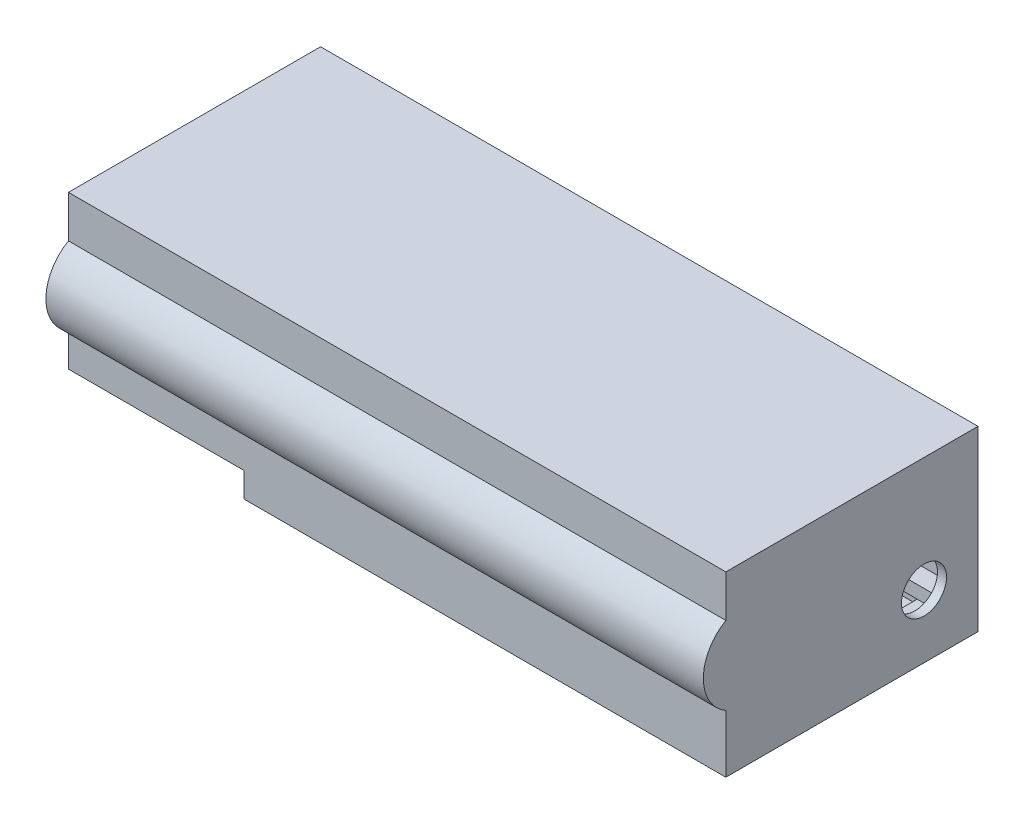
ISO-10303-21;
HEADER;
FILE_DESCRIPTION(('STEP AP214'),'2;1');
FILE_NAME('part.step','',(''),(''),'','','');
FILE_SCHEMA(('AUTOMOTIVE_DESIGN { 1 0 10303 214 1 1 1 1 }'));
ENDSEC;
DATA;
#1=APPLICATION_CONTEXT('core data for automotive mechanical design processes');
#2=APPLICATION_PROTOCOL_DEFINITION('international standard','automotive_design',2000,#1);
#3=PRODUCT_CONTEXT('',#1,'mechanical');
#4=PRODUCT('Part','Part','',(#3));
#5=PRODUCT_RELATED_PRODUCT_CATEGORY('part','',(#4));
#6=PRODUCT_DEFINITION_FORMATION('','',#4);
#7=PRODUCT_DEFINITION_CONTEXT('part definition',#1,'design');
#8=PRODUCT_DEFINITION('design','',#6,#7);
#9=PRODUCT_DEFINITION_SHAPE('','',#8);
#10=(LENGTH_UNIT() NAMED_UNIT(*) SI_UNIT(.MILLI.,.METRE.));
#11=(NAMED_UNIT(*) PLANE_ANGLE_UNIT() SI_UNIT($,.RADIAN.));
#12=(NAMED_UNIT(*) SI_UNIT($,.STERADIAN.) SOLID_ANGLE_UNIT());
#13=UNCERTAINTY_MEASURE_WITH_UNIT(LENGTH_MEASURE(1.E-05),#10,'distance_accuracy_value','');
#14=(GEOMETRIC_REPRESENTATION_CONTEXT(3) GLOBAL_UNCERTAINTY_ASSIGNED_CONTEXT((#13)) GLOBAL_UNIT_ASSIGNED_CONTEXT((#10,
#11,#12)) REPRESENTATION_CONTEXT('',''));
#15=CARTESIAN_POINT('',(0.,0.,0.));
#16=DIRECTION('',(0.,0.,1.));
#17=DIRECTION('',(1.,0.,0.));
#18=AXIS2_PLACEMENT_3D('',#15,#16,#17);
#19=CARTESIAN_POINT('',(144.,39.5,28.));
#20=DIRECTION('',(0.,0.,1.));
#21=DIRECTION('',(0.,-1.,0.));
#22=AXIS2_PLACEMENT_3D('',#19,#20,#21);
#23=PLANE('',#22);
#24=DIRECTION('',(1.,0.,0.));
#25=VECTOR('',#24,1.);
#26=CARTESIAN_POINT('',(0.,30.1602540378444,28.));
#27=LINE('',#26,#25);
#28=CARTESIAN_POINT('',(0.,30.1602540378444,28.));
#29=VERTEX_POINT('',#28);
#30=CARTESIAN_POINT('',(146.,30.1602540378444,28.));
#31=VERTEX_POINT('',#30);
#32=EDGE_CURVE('E293',#29,#31,#27,.T.);
#33=ORIENTED_EDGE('',*,*,#32,.T.);
#34=DIRECTION('',(0.,-1.,0.));
#35=VECTOR('',#34,1.);
#36=CARTESIAN_POINT('',(146.,39.5,28.));
#37=LINE('',#36,#35);
#38=CARTESIAN_POINT('',(146.,39.5,28.));
#39=VERTEX_POINT('',#38);
#40=EDGE_CURVE('E449',#39,#31,#37,.T.);
#41=ORIENTED_EDGE('',*,*,#40,.F.);
#42=DIRECTION('',(-1.,0.,0.));
#43=VECTOR('',#42,1.);
#44=CARTESIAN_POINT('',(144.,39.5,28.));
#45=LINE('',#44,#43);
#46=CARTESIAN_POINT('',(0.,39.5,28.));
#47=VERTEX_POINT('',#46);
#48=EDGE_CURVE('E371',#39,#47,#45,.T.);
#49=ORIENTED_EDGE('',*,*,#48,.T.);
#50=DIRECTION('',(0.,1.,0.));
#51=VECTOR('',#50,1.);
#52=CARTESIAN_POINT('',(0.,39.5,28.));
#53=LINE('',#52,#51);
#54=EDGE_CURVE('E338',#29,#47,#53,.T.);
#55=ORIENTED_EDGE('',*,*,#54,.F.);
#56=EDGE_LOOP('',(#33,#41,#49,#55));
#57=FACE_BOUND('',#56,.T.);
#58=ADVANCED_FACE('F35',(#57),#23,.T.);
#59=CARTESIAN_POINT('',(146.,12.8397459621556,28.));
#60=VERTEX_POINT('',#59);
#61=CARTESIAN_POINT('',(146.,0.,28.));
#62=VERTEX_POINT('',#61);
#63=EDGE_CURVE('E500',#60,#62,#37,.T.);
#64=ORIENTED_EDGE('',*,*,#63,.F.);
#65=DIRECTION('',(1.,0.,0.));
#66=VECTOR('',#65,1.);
#67=CARTESIAN_POINT('',(0.,12.8397459621556,28.));
#68=LINE('',#67,#66);
#69=CARTESIAN_POINT('',(0.,12.8397459621556,28.));
#70=VERTEX_POINT('',#69);
#71=EDGE_CURVE('E292',#70,#60,#68,.T.);
#72=ORIENTED_EDGE('',*,*,#71,.F.);
#73=CARTESIAN_POINT('',(0.,5.5,28.));
#74=VERTEX_POINT('',#73);
#75=EDGE_CURVE('E350',#74,#70,#53,.T.);
#76=ORIENTED_EDGE('',*,*,#75,.F.);
#77=DIRECTION('',(-1.,0.,0.));
#78=VECTOR('',#77,1.);
#79=CARTESIAN_POINT('',(144.,5.5,28.));
#80=LINE('',#79,#78);
#81=CARTESIAN_POINT('',(39.,5.5,28.));
#82=VERTEX_POINT('',#81);
#83=EDGE_CURVE('E276',#82,#74,#80,.T.);
#84=ORIENTED_EDGE('',*,*,#83,.F.);
#85=DIRECTION('',(0.,1.,0.));
#86=VECTOR('',#85,1.);
#87=CARTESIAN_POINT('',(39.,39.5,28.));
#88=LINE('',#87,#86);
#89=CARTESIAN_POINT('',(39.,0.,28.));
#90=VERTEX_POINT('',#89);
#91=EDGE_CURVE('E246',#90,#82,#88,.T.);
#92=ORIENTED_EDGE('',*,*,#91,.F.);
#93=DIRECTION('',(-1.,0.,0.));
#94=VECTOR('',#93,1.);
#95=CARTESIAN_POINT('',(144.,0.,28.));
#96=LINE('',#95,#94);
#97=EDGE_CURVE('E369',#62,#90,#96,.T.);
#98=ORIENTED_EDGE('',*,*,#97,.F.);
#99=EDGE_LOOP('',(#64,#72,#76,#84,#92,#98));
#100=FACE_BOUND('',#99,.T.);
#101=ADVANCED_FACE('F516',(#100),#23,.T.);
#102=CARTESIAN_POINT('',(0.,37.5,26.));
#103=DIRECTION('',(0.,0.,-1.));
#104=DIRECTION('',(0.,1.,0.));
#105=AXIS2_PLACEMENT_3D('',#102,#103,#104);
#106=PLANE('',#105);
#107=DIRECTION('',(1.,0.,0.));
#108=VECTOR('',#107,1.);
#109=CARTESIAN_POINT('',(0.,28.0366310572456,26.));
#110=LINE('',#109,#108);
#111=CARTESIAN_POINT('',(0.,28.0366310572456,26.));
#112=VERTEX_POINT('',#111);
#113=CARTESIAN_POINT('',(144.,28.0366310572456,26.));
#114=VERTEX_POINT('',#113);
#115=EDGE_CURVE('E285',#112,#114,#110,.T.);
#116=ORIENTED_EDGE('',*,*,#115,.F.);
#117=DIRECTION('',(0.,1.,0.));
#118=VECTOR('',#117,1.);
#119=CARTESIAN_POINT('',(0.,37.5,26.));
#120=LINE('',#119,#118);
#121=CARTESIAN_POINT('',(0.,37.5,26.));
#122=VERTEX_POINT('',#121);
#123=EDGE_CURVE('E296',#112,#122,#120,.T.);
#124=ORIENTED_EDGE('',*,*,#123,.T.);
#125=DIRECTION('',(1.,0.,0.));
#126=VECTOR('',#125,1.);
#127=CARTESIAN_POINT('',(0.,37.5,26.));
#128=LINE('',#127,#126);
#129=CARTESIAN_POINT('',(144.,37.5,26.));
#130=VERTEX_POINT('',#129);
#131=EDGE_CURVE('E303',#122,#130,#128,.T.);
#132=ORIENTED_EDGE('',*,*,#131,.T.);
#133=DIRECTION('',(0.,-1.,0.));
#134=VECTOR('',#133,1.);
#135=CARTESIAN_POINT('',(144.,0.,26.));
#136=LINE('',#135,#134);
#137=EDGE_CURVE('E316',#130,#114,#136,.T.);
#138=ORIENTED_EDGE('',*,*,#137,.T.);
#139=EDGE_LOOP('',(#116,#124,#132,#138));
#140=FACE_BOUND('',#139,.T.);
#141=ADVANCED_FACE('F543',(#140),#106,.T.);
#142=CARTESIAN_POINT('',(0.,0.,0.));
#143=DIRECTION('',(-1.,0.,0.));
#144=DIRECTION('',(0.,0.,1.));
#145=AXIS2_PLACEMENT_3D('',#142,#143,#144);
#146=PLANE('',#145);
#147=DIRECTION('',(0.,0.,1.));
#148=VECTOR('',#147,1.);
#149=CARTESIAN_POINT('',(0.,5.5,25.));
#150=LINE('',#149,#148);
#151=CARTESIAN_POINT('',(0.,5.5,22.));
#152=VERTEX_POINT('',#151);
#153=EDGE_CURVE('E352',#152,#74,#150,.T.);
#154=ORIENTED_EDGE('',*,*,#153,.T.);
#155=ORIENTED_EDGE('',*,*,#75,.T.);
#156=CARTESIAN_POINT('',(0.,21.5,23.));
#157=DIRECTION('',(1.,0.,0.));
#158=DIRECTION('',(0.,0.,-1.));
#159=AXIS2_PLACEMENT_3D('',#156,#157,#158);
#160=CIRCLE('',#159,10.);
#161=EDGE_CURVE('E289',#29,#70,#160,.T.);
#162=ORIENTED_EDGE('',*,*,#161,.F.);
#163=ORIENTED_EDGE('',*,*,#54,.T.);
#164=DIRECTION('',(0.,0.,1.));
#165=VECTOR('',#164,1.);
#166=CARTESIAN_POINT('',(0.,39.5,0.));
#167=LINE('',#166,#165);
#168=CARTESIAN_POINT('',(0.,39.5,-28.));
#169=VERTEX_POINT('',#168);
#170=EDGE_CURVE('E378',#169,#47,#167,.T.);
#171=ORIENTED_EDGE('',*,*,#170,.F.);
#172=DIRECTION('',(0.,1.,0.));
#173=VECTOR('',#172,1.);
#174=CARTESIAN_POINT('',(0.,39.5,-28.));
#175=LINE('',#174,#173);
#176=CARTESIAN_POINT('',(0.,5.50000000000002,-28.));
#177=VERTEX_POINT('',#176);
#178=EDGE_CURVE('E391',#177,#169,#175,.T.);
#179=ORIENTED_EDGE('',*,*,#178,.F.);
#180=DIRECTION('',(0.,0.,-1.));
#181=VECTOR('',#180,1.);
#182=CARTESIAN_POINT('',(0.,5.5,-25.));
#183=LINE('',#182,#181);
#184=CARTESIAN_POINT('',(0.,5.5,-22.));
#185=VERTEX_POINT('',#184);
#186=EDGE_CURVE('E389',#185,#177,#183,.T.);
#187=ORIENTED_EDGE('',*,*,#186,.F.);
#188=DIRECTION('',(0.,-1.,0.));
#189=VECTOR('',#188,1.);
#190=CARTESIAN_POINT('',(0.,5.5,-22.));
#191=LINE('',#190,#189);
#192=CARTESIAN_POINT('',(0.,8.32842712474619,-22.));
#193=VERTEX_POINT('',#192);
#194=EDGE_CURVE('E386',#193,#185,#191,.T.);
#195=ORIENTED_EDGE('',*,*,#194,.F.);
#196=DIRECTION('',(0.,0.,-1.));
#197=VECTOR('',#196,1.);
#198=CARTESIAN_POINT('',(0.,8.32842712474619,-22.));
#199=LINE('',#198,#197);
#200=CARTESIAN_POINT('',(0.,8.32842712474619,-26.));
#201=VERTEX_POINT('',#200);
#202=EDGE_CURVE('E319',#193,#201,#199,.T.);
#203=ORIENTED_EDGE('',*,*,#202,.T.);
#204=DIRECTION('',(0.,1.,0.));
#205=VECTOR('',#204,1.);
#206=CARTESIAN_POINT('',(0.,37.5,-26.));
#207=LINE('',#206,#205);
#208=CARTESIAN_POINT('',(0.,37.5,-26.));
#209=VERTEX_POINT('',#208);
#210=EDGE_CURVE('E322',#201,#209,#207,.T.);
#211=ORIENTED_EDGE('',*,*,#210,.T.);
#212=DIRECTION('',(0.,0.,-1.));
#213=VECTOR('',#212,1.);
#214=CARTESIAN_POINT('',(0.,37.5,-22.));
#215=LINE('',#214,#213);
#216=EDGE_CURVE('E374',#122,#209,#215,.T.);
#217=ORIENTED_EDGE('',*,*,#216,.F.);
#218=ORIENTED_EDGE('',*,*,#123,.F.);
#219=CARTESIAN_POINT('',(0.,21.3284271247462,24.));
#220=DIRECTION('',(1.,0.,0.));
#221=DIRECTION('',(0.,0.,-1.));
#222=AXIS2_PLACEMENT_3D('',#219,#220,#221);
#223=CIRCLE('',#222,7.);
#224=CARTESIAN_POINT('',(0.,14.6202231922468,26.));
#225=VERTEX_POINT('',#224);
#226=EDGE_CURVE('E279',#112,#225,#223,.T.);
#227=ORIENTED_EDGE('',*,*,#226,.T.);
#228=CARTESIAN_POINT('',(0.,8.32842712474619,26.));
#229=VERTEX_POINT('',#228);
#230=EDGE_CURVE('E298',#229,#225,#120,.T.);
#231=ORIENTED_EDGE('',*,*,#230,.F.);
#232=DIRECTION('',(0.,0.,1.));
#233=VECTOR('',#232,1.);
#234=CARTESIAN_POINT('',(0.,8.32842712474619,22.));
#235=LINE('',#234,#233);
#236=CARTESIAN_POINT('',(0.,8.32842712474619,22.));
#237=VERTEX_POINT('',#236);
#238=EDGE_CURVE('E301',#237,#229,#235,.T.);
#239=ORIENTED_EDGE('',*,*,#238,.F.);
#240=DIRECTION('',(0.,-1.,0.));
#241=VECTOR('',#240,1.);
#242=CARTESIAN_POINT('',(0.,5.5,22.));
#243=LINE('',#242,#241);
#244=EDGE_CURVE('E343',#237,#152,#243,.T.);
#245=ORIENTED_EDGE('',*,*,#244,.T.);
#246=EDGE_LOOP('',(#154,#155,#162,#163,#171,#179,#187,#195,#203,#211,#217,#218,#227,#231,#239,#245));
#247=FACE_BOUND('',#246,.T.);
#248=ADVANCED_FACE('F528',(#247),#146,.T.);
#249=CARTESIAN_POINT('',(144.,5.5,22.));
#250=DIRECTION('',(0.,0.,-1.));
#251=DIRECTION('',(-1.,0.,0.));
#252=AXIS2_PLACEMENT_3D('',#249,#250,#251);
#253=PLANE('',#252);
#254=ORIENTED_EDGE('',*,*,#244,.F.);
#255=DIRECTION('',(1.,0.,0.));
#256=VECTOR('',#255,1.);
#257=CARTESIAN_POINT('',(0.,8.32842712474619,22.));
#258=LINE('',#257,#256);
#259=CARTESIAN_POINT('',(144.,8.32842712474619,22.));
#260=VERTEX_POINT('',#259);
#261=EDGE_CURVE('E304',#237,#260,#258,.T.);
#262=ORIENTED_EDGE('',*,*,#261,.T.);
#263=DIRECTION('',(0.,-1.,0.));
#264=VECTOR('',#263,1.);
#265=CARTESIAN_POINT('',(144.,5.5,22.));
#266=LINE('',#265,#264);
#267=CARTESIAN_POINT('',(144.,5.5,22.));
#268=VERTEX_POINT('',#267);
#269=EDGE_CURVE('E346',#260,#268,#266,.T.);
#270=ORIENTED_EDGE('',*,*,#269,.T.);
#271=DIRECTION('',(-1.,0.,0.));
#272=VECTOR('',#271,1.);
#273=CARTESIAN_POINT('',(144.,5.5,22.));
#274=LINE('',#273,#272);
#275=EDGE_CURVE('E349',#268,#152,#274,.T.);
#276=ORIENTED_EDGE('',*,*,#275,.T.);
#277=EDGE_LOOP('',(#254,#262,#270,#276));
#278=FACE_BOUND('',#277,.T.);
#279=ADVANCED_FACE('F525',(#278),#253,.T.);
#280=CARTESIAN_POINT('',(144.,37.5,-22.));
#281=DIRECTION('',(0.,1.,0.));
#282=DIRECTION('',(0.,0.,1.));
#283=AXIS2_PLACEMENT_3D('',#280,#281,#282);
#284=PLANE('',#283);
#285=ORIENTED_EDGE('',*,*,#216,.T.);
#286=DIRECTION('',(1.,0.,0.));
#287=VECTOR('',#286,1.);
#288=CARTESIAN_POINT('',(0.,37.5,-26.));
#289=LINE('',#288,#287);
#290=CARTESIAN_POINT('',(144.,37.5,-26.));
#291=VERTEX_POINT('',#290);
#292=EDGE_CURVE('E326',#209,#291,#289,.T.);
#293=ORIENTED_EDGE('',*,*,#292,.T.);
#294=DIRECTION('',(0.,0.,-1.));
#295=VECTOR('',#294,1.);
#296=CARTESIAN_POINT('',(144.,37.5,-22.));
#297=LINE('',#296,#295);
#298=EDGE_CURVE('E375',#130,#291,#297,.T.);
#299=ORIENTED_EDGE('',*,*,#298,.F.);
#300=ORIENTED_EDGE('',*,*,#131,.F.);
#301=EDGE_LOOP('',(#285,#293,#299,#300));
#302=FACE_BOUND('',#301,.T.);
#303=ADVANCED_FACE('F37',(#302),#284,.F.);
#304=CARTESIAN_POINT('',(144.,5.5,-22.));
#305=DIRECTION('',(0.,0.,-1.));
#306=DIRECTION('',(-1.,0.,0.));
#307=AXIS2_PLACEMENT_3D('',#304,#305,#306);
#308=PLANE('',#307);
#309=DIRECTION('',(0.,-1.,0.));
#310=VECTOR('',#309,1.);
#311=CARTESIAN_POINT('',(144.,5.5,-22.));
#312=LINE('',#311,#310);
#313=CARTESIAN_POINT('',(144.,8.32842712474619,-22.));
#314=VERTEX_POINT('',#313);
#315=CARTESIAN_POINT('',(144.,5.5,-22.));
#316=VERTEX_POINT('',#315);
#317=EDGE_CURVE('E377',#314,#316,#312,.T.);
#318=ORIENTED_EDGE('',*,*,#317,.F.);
#319=DIRECTION('',(1.,0.,0.));
#320=VECTOR('',#319,1.);
#321=CARTESIAN_POINT('',(0.,8.32842712474619,-22.));
#322=LINE('',#321,#320);
#323=EDGE_CURVE('E325',#193,#314,#322,.T.);
#324=ORIENTED_EDGE('',*,*,#323,.F.);
#325=ORIENTED_EDGE('',*,*,#194,.T.);
#326=DIRECTION('',(-1.,0.,0.));
#327=VECTOR('',#326,1.);
#328=CARTESIAN_POINT('',(144.,5.5,-22.));
#329=LINE('',#328,#327);
#330=EDGE_CURVE('E408',#316,#185,#329,.T.);
#331=ORIENTED_EDGE('',*,*,#330,.F.);
#332=EDGE_LOOP('',(#318,#324,#325,#331));
#333=FACE_BOUND('',#332,.T.);
#334=ADVANCED_FACE('F562',(#333),#308,.F.);
#335=CARTESIAN_POINT('',(144.,5.5,-25.));
#336=DIRECTION('',(0.,1.,0.));
#337=DIRECTION('',(0.,0.,1.));
#338=AXIS2_PLACEMENT_3D('',#335,#336,#337);
#339=PLANE('',#338);
#340=ORIENTED_EDGE('',*,*,#330,.T.);
#341=ORIENTED_EDGE('',*,*,#186,.T.);
#342=DIRECTION('',(-1.,0.,0.));
#343=VECTOR('',#342,1.);
#344=CARTESIAN_POINT('',(144.,5.50000000000001,-28.));
#345=LINE('',#344,#343);
#346=CARTESIAN_POINT('',(39.,5.50000000000001,-28.));
#347=VERTEX_POINT('',#346);
#348=EDGE_CURVE('E273',#347,#177,#345,.T.);
#349=ORIENTED_EDGE('',*,*,#348,.F.);
#350=DIRECTION('',(0.,0.,-1.));
#351=VECTOR('',#350,1.);
#352=CARTESIAN_POINT('',(39.,5.49999999999999,33.));
#353=LINE('',#352,#351);
#354=CARTESIAN_POINT('',(39.,5.5,-25.));
#355=VERTEX_POINT('',#354);
#356=EDGE_CURVE('E264',#355,#347,#353,.T.);
#357=ORIENTED_EDGE('',*,*,#356,.F.);
#358=DIRECTION('',(-1.,0.,0.));
#359=VECTOR('',#358,1.);
#360=CARTESIAN_POINT('',(144.,5.5,-25.));
#361=LINE('',#360,#359);
#362=CARTESIAN_POINT('',(144.,5.5,-25.));
#363=VERTEX_POINT('',#362);
#364=EDGE_CURVE('E241',#363,#355,#361,.T.);
#365=ORIENTED_EDGE('',*,*,#364,.F.);
#366=DIRECTION('',(0.,0.,-1.));
#367=VECTOR('',#366,1.);
#368=CARTESIAN_POINT('',(144.,5.5,-25.));
#369=LINE('',#368,#367);
#370=EDGE_CURVE('E380',#316,#363,#369,.T.);
#371=ORIENTED_EDGE('',*,*,#370,.F.);
#372=EDGE_LOOP('',(#340,#341,#349,#357,#365,#371));
#373=FACE_BOUND('',#372,.T.);
#374=ADVANCED_FACE('F565',(#373),#339,.F.);
#375=CARTESIAN_POINT('',(144.,1.5,-25.));
#376=DIRECTION('',(0.,0.,-1.));
#377=DIRECTION('',(-1.,0.,0.));
#378=AXIS2_PLACEMENT_3D('',#375,#376,#377);
#379=PLANE('',#378);
#380=DIRECTION('',(0.,-1.,0.));
#381=VECTOR('',#380,1.);
#382=CARTESIAN_POINT('',(121.,3.,-25.));
#383=LINE('',#382,#381);
#384=CARTESIAN_POINT('',(121.,1.5,-25.));
#385=VERTEX_POINT('',#384);
#386=CARTESIAN_POINT('',(121.,0.,-25.));
#387=VERTEX_POINT('',#386);
#388=EDGE_CURVE('E486',#385,#387,#383,.T.);
#389=ORIENTED_EDGE('',*,*,#388,.F.);
#390=DIRECTION('',(-1.,0.,0.));
#391=VECTOR('',#390,1.);
#392=CARTESIAN_POINT('',(144.,1.5,-25.));
#393=LINE('',#392,#391);
#394=CARTESIAN_POINT('',(136.,1.5,-25.));
#395=VERTEX_POINT('',#394);
#396=EDGE_CURVE('E404',#395,#385,#393,.T.);
#397=ORIENTED_EDGE('',*,*,#396,.F.);
#398=DIRECTION('',(0.,1.,0.));
#399=VECTOR('',#398,1.);
#400=CARTESIAN_POINT('',(136.,1.5,-25.));
#401=LINE('',#400,#399);
#402=CARTESIAN_POINT('',(136.,2.99772007729695,-25.));
#403=VERTEX_POINT('',#402);
#404=EDGE_CURVE('E457',#395,#403,#401,.T.);
#405=ORIENTED_EDGE('',*,*,#404,.T.);
#406=DIRECTION('',(1.,0.,0.));
#407=VECTOR('',#406,1.);
#408=CARTESIAN_POINT('',(144.,2.99772007729695,-25.));
#409=LINE('',#408,#407);
#410=CARTESIAN_POINT('',(144.,2.99772007729695,-25.));
#411=VERTEX_POINT('',#410);
#412=EDGE_CURVE('E267',#403,#411,#409,.T.);
#413=ORIENTED_EDGE('',*,*,#412,.T.);
#414=DIRECTION('',(0.,-1.,0.));
#415=VECTOR('',#414,1.);
#416=CARTESIAN_POINT('',(144.,1.5,-25.));
#417=LINE('',#416,#415);
#418=EDGE_CURVE('E382',#363,#411,#417,.T.);
#419=ORIENTED_EDGE('',*,*,#418,.F.);
#420=ORIENTED_EDGE('',*,*,#364,.T.);
#421=DIRECTION('',(0.,-1.,0.));
#422=VECTOR('',#421,1.);
#423=CARTESIAN_POINT('',(39.,1.5,-25.));
#424=LINE('',#423,#422);
#425=CARTESIAN_POINT('',(39.,0.,-25.));
#426=VERTEX_POINT('',#425);
#427=EDGE_CURVE('E233',#355,#426,#424,.T.);
#428=ORIENTED_EDGE('',*,*,#427,.T.);
#429=DIRECTION('',(1.,0.,0.));
#430=VECTOR('',#429,1.);
#431=CARTESIAN_POINT('',(39.,0.,-25.));
#432=LINE('',#431,#430);
#433=EDGE_CURVE('E237',#426,#387,#432,.T.);
#434=ORIENTED_EDGE('',*,*,#433,.T.);
#435=EDGE_LOOP('',(#389,#397,#405,#413,#419,#420,#428,#434));
#436=FACE_BOUND('',#435,.T.);
#437=ADVANCED_FACE('F236',(#436),#379,.F.);
#438=CARTESIAN_POINT('',(144.,1.5,-22.));
#439=DIRECTION('',(0.,-1.,0.));
#440=DIRECTION('',(0.,0.,-1.));
#441=AXIS2_PLACEMENT_3D('',#438,#439,#440);
#442=PLANE('',#441);
#443=ORIENTED_EDGE('',*,*,#396,.T.);
#444=DIRECTION('',(0.,0.,1.));
#445=VECTOR('',#444,1.);
#446=CARTESIAN_POINT('',(121.,1.5,-22.));
#447=LINE('',#446,#445);
#448=CARTESIAN_POINT('',(121.,1.5,-22.));
#449=VERTEX_POINT('',#448);
#450=EDGE_CURVE('E463',#385,#449,#447,.T.);
#451=ORIENTED_EDGE('',*,*,#450,.T.);
#452=DIRECTION('',(-1.,0.,0.));
#453=VECTOR('',#452,1.);
#454=CARTESIAN_POINT('',(144.,1.5,-22.));
#455=LINE('',#454,#453);
#456=CARTESIAN_POINT('',(136.,1.5,-22.));
#457=VERTEX_POINT('',#456);
#458=EDGE_CURVE('E401',#457,#449,#455,.T.);
#459=ORIENTED_EDGE('',*,*,#458,.F.);
#460=DIRECTION('',(0.,0.,-1.));
#461=VECTOR('',#460,1.);
#462=CARTESIAN_POINT('',(136.,1.5,-22.));
#463=LINE('',#462,#461);
#464=EDGE_CURVE('E455',#457,#395,#463,.T.);
#465=ORIENTED_EDGE('',*,*,#464,.T.);
#466=EDGE_LOOP('',(#443,#451,#459,#465));
#467=FACE_BOUND('',#466,.T.);
#468=ADVANCED_FACE('F461',(#467),#442,.F.);
#469=CARTESIAN_POINT('',(144.,0.,-22.));
#470=DIRECTION('',(0.,0.,-1.));
#471=DIRECTION('',(-1.,0.,0.));
#472=AXIS2_PLACEMENT_3D('',#469,#470,#471);
#473=PLANE('',#472);
#474=ORIENTED_EDGE('',*,*,#458,.T.);
#475=DIRECTION('',(0.,-1.,0.));
#476=VECTOR('',#475,1.);
#477=CARTESIAN_POINT('',(121.,0.,-22.));
#478=LINE('',#477,#476);
#479=CARTESIAN_POINT('',(121.,0.,-22.));
#480=VERTEX_POINT('',#479);
#481=EDGE_CURVE('E468',#449,#480,#478,.T.);
#482=ORIENTED_EDGE('',*,*,#481,.T.);
#483=DIRECTION('',(-1.,0.,0.));
#484=VECTOR('',#483,1.);
#485=CARTESIAN_POINT('',(144.,0.,-22.));
#486=LINE('',#485,#484);
#487=CARTESIAN_POINT('',(136.,0.,-22.));
#488=VERTEX_POINT('',#487);
#489=EDGE_CURVE('E399',#488,#480,#486,.T.);
#490=ORIENTED_EDGE('',*,*,#489,.F.);
#491=DIRECTION('',(0.,1.,0.));
#492=VECTOR('',#491,1.);
#493=CARTESIAN_POINT('',(136.,0.,-22.));
#494=LINE('',#493,#492);
#495=EDGE_CURVE('E452',#488,#457,#494,.T.);
#496=ORIENTED_EDGE('',*,*,#495,.T.);
#497=EDGE_LOOP('',(#474,#482,#490,#496));
#498=FACE_BOUND('',#497,.T.);
#499=ADVANCED_FACE('F466',(#498),#473,.F.);
#500=CARTESIAN_POINT('',(144.,0.,-28.));
#501=DIRECTION('',(0.,1.,0.));
#502=DIRECTION('',(0.,0.,1.));
#503=AXIS2_PLACEMENT_3D('',#500,#501,#502);
#504=PLANE('',#503);
#505=DIRECTION('',(0.,0.,-1.));
#506=VECTOR('',#505,1.);
#507=CARTESIAN_POINT('',(39.,0.,33.));
#508=LINE('',#507,#506);
#509=CARTESIAN_POINT('',(39.,0.,25.));
#510=VERTEX_POINT('',#509);
#511=EDGE_CURVE('E261',#90,#510,#508,.T.);
#512=ORIENTED_EDGE('',*,*,#511,.T.);
#513=DIRECTION('',(-1.,0.,0.));
#514=VECTOR('',#513,1.);
#515=CARTESIAN_POINT('',(39.,0.,25.));
#516=LINE('',#515,#514);
#517=CARTESIAN_POINT('',(121.,0.,25.));
#518=VERTEX_POINT('',#517);
#519=EDGE_CURVE('E484',#518,#510,#516,.T.);
#520=ORIENTED_EDGE('',*,*,#519,.F.);
#521=DIRECTION('',(0.,0.,1.));
#522=VECTOR('',#521,1.);
#523=CARTESIAN_POINT('',(121.,0.,25.));
#524=LINE('',#523,#522);
#525=CARTESIAN_POINT('',(121.,0.,22.));
#526=VERTEX_POINT('',#525);
#527=EDGE_CURVE('E256',#526,#518,#524,.T.);
#528=ORIENTED_EDGE('',*,*,#527,.F.);
#529=DIRECTION('',(-1.,0.,0.));
#530=VECTOR('',#529,1.);
#531=CARTESIAN_POINT('',(144.,0.,22.));
#532=LINE('',#531,#530);
#533=CARTESIAN_POINT('',(136.,0.,22.));
#534=VERTEX_POINT('',#533);
#535=EDGE_CURVE('E366',#534,#526,#532,.T.);
#536=ORIENTED_EDGE('',*,*,#535,.F.);
#537=DIRECTION('',(0.,0.,-1.));
#538=VECTOR('',#537,1.);
#539=CARTESIAN_POINT('',(136.,0.,28.));
#540=LINE('',#539,#538);
#541=EDGE_CURVE('E429',#534,#488,#540,.T.);
#542=ORIENTED_EDGE('',*,*,#541,.T.);
#543=ORIENTED_EDGE('',*,*,#489,.T.);
#544=EDGE_CURVE('E255',#387,#480,#524,.T.);
#545=ORIENTED_EDGE('',*,*,#544,.F.);
#546=ORIENTED_EDGE('',*,*,#433,.F.);
#547=CARTESIAN_POINT('',(39.,0.,-28.));
#548=VERTEX_POINT('',#547);
#549=EDGE_CURVE('E252',#426,#548,#508,.T.);
#550=ORIENTED_EDGE('',*,*,#549,.T.);
#551=DIRECTION('',(-1.,0.,0.));
#552=VECTOR('',#551,1.);
#553=CARTESIAN_POINT('',(144.,0.,-28.));
#554=LINE('',#553,#552);
#555=CARTESIAN_POINT('',(146.,0.,-28.));
#556=VERTEX_POINT('',#555);
#557=EDGE_CURVE('E397',#556,#548,#554,.T.);
#558=ORIENTED_EDGE('',*,*,#557,.F.);
#559=DIRECTION('',(0.,0.,-1.));
#560=VECTOR('',#559,1.);
#561=CARTESIAN_POINT('',(146.,0.,28.));
#562=LINE('',#561,#560);
#563=EDGE_CURVE('E444',#62,#556,#562,.T.);
#564=ORIENTED_EDGE('',*,*,#563,.F.);
#565=ORIENTED_EDGE('',*,*,#97,.T.);
#566=EDGE_LOOP('',(#512,#520,#528,#536,#542,#543,#545,#546,#550,#558,#564,#565));
#567=FACE_BOUND('',#566,.T.);
#568=ADVANCED_FACE('F251',(#567),#504,.F.);
#569=CARTESIAN_POINT('',(144.,39.5,-28.));
#570=DIRECTION('',(0.,0.,1.));
#571=DIRECTION('',(0.,-1.,0.));
#572=AXIS2_PLACEMENT_3D('',#569,#570,#571);
#573=PLANE('',#572);
#574=DIRECTION('',(-1.,0.,0.));
#575=VECTOR('',#574,1.);
#576=CARTESIAN_POINT('',(144.,39.5,-28.));
#577=LINE('',#576,#575);
#578=CARTESIAN_POINT('',(146.,39.5,-28.));
#579=VERTEX_POINT('',#578);
#580=EDGE_CURVE('E384',#579,#169,#577,.T.);
#581=ORIENTED_EDGE('',*,*,#580,.F.);
#582=DIRECTION('',(0.,-1.,0.));
#583=VECTOR('',#582,1.);
#584=CARTESIAN_POINT('',(146.,39.5,-28.));
#585=LINE('',#584,#583);
#586=EDGE_CURVE('E439',#579,#556,#585,.T.);
#587=ORIENTED_EDGE('',*,*,#586,.T.);
#588=ORIENTED_EDGE('',*,*,#557,.T.);
#589=DIRECTION('',(0.,1.,0.));
#590=VECTOR('',#589,1.);
#591=CARTESIAN_POINT('',(39.,39.5,-28.));
#592=LINE('',#591,#590);
#593=EDGE_CURVE('E247',#548,#347,#592,.T.);
#594=ORIENTED_EDGE('',*,*,#593,.T.);
#595=ORIENTED_EDGE('',*,*,#348,.T.);
#596=ORIENTED_EDGE('',*,*,#178,.T.);
#597=EDGE_LOOP('',(#581,#587,#588,#594,#595,#596));
#598=FACE_BOUND('',#597,.T.);
#599=ADVANCED_FACE('F508',(#598),#573,.F.);
#600=CARTESIAN_POINT('',(144.,39.5,0.));
#601=DIRECTION('',(0.,-1.,0.));
#602=DIRECTION('',(0.,0.,-1.));
#603=AXIS2_PLACEMENT_3D('',#600,#601,#602);
#604=PLANE('',#603);
#605=ORIENTED_EDGE('',*,*,#170,.T.);
#606=ORIENTED_EDGE('',*,*,#48,.F.);
#607=DIRECTION('',(0.,0.,-1.));
#608=VECTOR('',#607,1.);
#609=CARTESIAN_POINT('',(146.,39.5,28.));
#610=LINE('',#609,#608);
#611=EDGE_CURVE('E447',#39,#579,#610,.T.);
#612=ORIENTED_EDGE('',*,*,#611,.T.);
#613=ORIENTED_EDGE('',*,*,#580,.T.);
#614=EDGE_LOOP('',(#605,#606,#612,#613));
#615=FACE_BOUND('',#614,.T.);
#616=ADVANCED_FACE('F569',(#615),#604,.F.);
#617=CARTESIAN_POINT('',(144.,0.,22.));
#618=DIRECTION('',(0.,0.,-1.));
#619=DIRECTION('',(-1.,0.,0.));
#620=AXIS2_PLACEMENT_3D('',#617,#618,#619);
#621=PLANE('',#620);
#622=DIRECTION('',(0.,-1.,0.));
#623=VECTOR('',#622,1.);
#624=CARTESIAN_POINT('',(121.,0.,22.));
#625=LINE('',#624,#623);
#626=CARTESIAN_POINT('',(121.,1.5,22.));
#627=VERTEX_POINT('',#626);
#628=EDGE_CURVE('E478',#627,#526,#625,.T.);
#629=ORIENTED_EDGE('',*,*,#628,.F.);
#630=DIRECTION('',(-1.,0.,0.));
#631=VECTOR('',#630,1.);
#632=CARTESIAN_POINT('',(144.,1.5,22.));
#633=LINE('',#632,#631);
#634=CARTESIAN_POINT('',(136.,1.5,22.));
#635=VERTEX_POINT('',#634);
#636=EDGE_CURVE('E363',#635,#627,#633,.T.);
#637=ORIENTED_EDGE('',*,*,#636,.F.);
#638=DIRECTION('',(0.,1.,0.));
#639=VECTOR('',#638,1.);
#640=CARTESIAN_POINT('',(136.,0.,22.));
#641=LINE('',#640,#639);
#642=EDGE_CURVE('E436',#534,#635,#641,.T.);
#643=ORIENTED_EDGE('',*,*,#642,.F.);
#644=ORIENTED_EDGE('',*,*,#535,.T.);
#645=EDGE_LOOP('',(#629,#637,#643,#644));
#646=FACE_BOUND('',#645,.T.);
#647=ADVANCED_FACE('F476',(#646),#621,.T.);
#648=CARTESIAN_POINT('',(144.,1.5,22.));
#649=DIRECTION('',(0.,1.,0.));
#650=DIRECTION('',(0.,0.,1.));
#651=AXIS2_PLACEMENT_3D('',#648,#649,#650);
#652=PLANE('',#651);
#653=DIRECTION('',(0.,0.,-1.));
#654=VECTOR('',#653,1.);
#655=CARTESIAN_POINT('',(121.,1.5,22.));
#656=LINE('',#655,#654);
#657=CARTESIAN_POINT('',(121.,1.5,25.));
#658=VERTEX_POINT('',#657);
#659=EDGE_CURVE('E482',#658,#627,#656,.T.);
#660=ORIENTED_EDGE('',*,*,#659,.F.);
#661=DIRECTION('',(-1.,0.,0.));
#662=VECTOR('',#661,1.);
#663=CARTESIAN_POINT('',(144.,1.5,25.));
#664=LINE('',#663,#662);
#665=CARTESIAN_POINT('',(136.,1.5,25.));
#666=VERTEX_POINT('',#665);
#667=EDGE_CURVE('E360',#666,#658,#664,.T.);
#668=ORIENTED_EDGE('',*,*,#667,.F.);
#669=DIRECTION('',(0.,0.,1.));
#670=VECTOR('',#669,1.);
#671=CARTESIAN_POINT('',(136.,1.5,22.));
#672=LINE('',#671,#670);
#673=EDGE_CURVE('E419',#635,#666,#672,.T.);
#674=ORIENTED_EDGE('',*,*,#673,.F.);
#675=ORIENTED_EDGE('',*,*,#636,.T.);
#676=EDGE_LOOP('',(#660,#668,#674,#675));
#677=FACE_BOUND('',#676,.T.);
#678=ADVANCED_FACE('F481',(#677),#652,.T.);
#679=CARTESIAN_POINT('',(144.,1.5,25.));
#680=DIRECTION('',(0.,0.,-1.));
#681=DIRECTION('',(-1.,0.,0.));
#682=AXIS2_PLACEMENT_3D('',#679,#680,#681);
#683=PLANE('',#682);
#684=ORIENTED_EDGE('',*,*,#667,.T.);
#685=DIRECTION('',(0.,-1.,0.));
#686=VECTOR('',#685,1.);
#687=CARTESIAN_POINT('',(121.,3.,25.));
#688=LINE('',#687,#686);
#689=EDGE_CURVE('E483',#658,#518,#688,.T.);
#690=ORIENTED_EDGE('',*,*,#689,.T.);
#691=ORIENTED_EDGE('',*,*,#519,.T.);
#692=DIRECTION('',(0.,-1.,0.));
#693=VECTOR('',#692,1.);
#694=CARTESIAN_POINT('',(39.,1.5,25.));
#695=LINE('',#694,#693);
#696=CARTESIAN_POINT('',(39.,5.5,25.));
#697=VERTEX_POINT('',#696);
#698=EDGE_CURVE('E51',#697,#510,#695,.T.);
#699=ORIENTED_EDGE('',*,*,#698,.F.);
#700=DIRECTION('',(-1.,0.,0.));
#701=VECTOR('',#700,1.);
#702=CARTESIAN_POINT('',(144.,5.5,25.));
#703=LINE('',#702,#701);
#704=CARTESIAN_POINT('',(144.,5.5,25.));
#705=VERTEX_POINT('',#704);
#706=EDGE_CURVE('E357',#705,#697,#703,.T.);
#707=ORIENTED_EDGE('',*,*,#706,.F.);
#708=DIRECTION('',(0.,-1.,0.));
#709=VECTOR('',#708,1.);
#710=CARTESIAN_POINT('',(144.,1.5,25.));
#711=LINE('',#710,#709);
#712=CARTESIAN_POINT('',(144.,2.99772007729694,25.));
#713=VERTEX_POINT('',#712);
#714=EDGE_CURVE('E339',#705,#713,#711,.T.);
#715=ORIENTED_EDGE('',*,*,#714,.T.);
#716=DIRECTION('',(1.,0.,0.));
#717=VECTOR('',#716,1.);
#718=CARTESIAN_POINT('',(144.,2.99772007729694,25.));
#719=LINE('',#718,#717);
#720=CARTESIAN_POINT('',(136.,2.99772007729694,25.));
#721=VERTEX_POINT('',#720);
#722=EDGE_CURVE('E11',#721,#713,#719,.T.);
#723=ORIENTED_EDGE('',*,*,#722,.F.);
#724=DIRECTION('',(0.,1.,0.));
#725=VECTOR('',#724,1.);
#726=CARTESIAN_POINT('',(136.,1.5,25.));
#727=LINE('',#726,#725);
#728=EDGE_CURVE('E44',#666,#721,#727,.T.);
#729=ORIENTED_EDGE('',*,*,#728,.F.);
#730=EDGE_LOOP('',(#684,#690,#691,#699,#707,#715,#723,#729));
#731=FACE_BOUND('',#730,.T.);
#732=ADVANCED_FACE('F431',(#731),#683,.T.);
#733=CARTESIAN_POINT('',(144.,5.5,25.));
#734=DIRECTION('',(0.,-1.,0.));
#735=DIRECTION('',(0.,0.,-1.));
#736=AXIS2_PLACEMENT_3D('',#733,#734,#735);
#737=PLANE('',#736);
#738=ORIENTED_EDGE('',*,*,#706,.T.);
#739=EDGE_CURVE('E262',#82,#697,#353,.T.);
#740=ORIENTED_EDGE('',*,*,#739,.F.);
#741=ORIENTED_EDGE('',*,*,#83,.T.);
#742=ORIENTED_EDGE('',*,*,#153,.F.);
#743=ORIENTED_EDGE('',*,*,#275,.F.);
#744=DIRECTION('',(0.,0.,1.));
#745=VECTOR('',#744,1.);
#746=CARTESIAN_POINT('',(144.,5.5,25.));
#747=LINE('',#746,#745);
#748=EDGE_CURVE('E342',#268,#705,#747,.T.);
#749=ORIENTED_EDGE('',*,*,#748,.T.);
#750=EDGE_LOOP('',(#738,#740,#741,#742,#743,#749));
#751=FACE_BOUND('',#750,.T.);
#752=ADVANCED_FACE('F521',(#751),#737,.T.);
#753=CARTESIAN_POINT('',(0.,37.5,-26.));
#754=DIRECTION('',(0.,0.,-1.));
#755=DIRECTION('',(0.,1.,0.));
#756=AXIS2_PLACEMENT_3D('',#753,#754,#755);
#757=PLANE('',#756);
#758=ORIENTED_EDGE('',*,*,#292,.F.);
#759=ORIENTED_EDGE('',*,*,#210,.F.);
#760=DIRECTION('',(1.,0.,0.));
#761=VECTOR('',#760,1.);
#762=CARTESIAN_POINT('',(0.,8.32842712474619,-26.));
#763=LINE('',#762,#761);
#764=CARTESIAN_POINT('',(144.,8.32842712474619,-26.));
#765=VERTEX_POINT('',#764);
#766=EDGE_CURVE('E330',#201,#765,#763,.T.);
#767=ORIENTED_EDGE('',*,*,#766,.T.);
#768=DIRECTION('',(0.,-1.,0.));
#769=VECTOR('',#768,1.);
#770=CARTESIAN_POINT('',(144.,0.,-26.));
#771=LINE('',#770,#769);
#772=EDGE_CURVE('E336',#291,#765,#771,.T.);
#773=ORIENTED_EDGE('',*,*,#772,.F.);
#774=EDGE_LOOP('',(#758,#759,#767,#773));
#775=FACE_BOUND('',#774,.T.);
#776=ADVANCED_FACE('F551',(#775),#757,.F.);
#777=CARTESIAN_POINT('',(0.,8.32842712474619,-22.));
#778=DIRECTION('',(0.,-1.,0.));
#779=DIRECTION('',(0.,0.,-1.));
#780=AXIS2_PLACEMENT_3D('',#777,#778,#779);
#781=PLANE('',#780);
#782=ORIENTED_EDGE('',*,*,#766,.F.);
#783=ORIENTED_EDGE('',*,*,#202,.F.);
#784=ORIENTED_EDGE('',*,*,#323,.T.);
#785=DIRECTION('',(0.,0.,1.));
#786=VECTOR('',#785,1.);
#787=CARTESIAN_POINT('',(144.,8.32842712474619,0.));
#788=LINE('',#787,#786);
#789=EDGE_CURVE('E329',#765,#314,#788,.T.);
#790=ORIENTED_EDGE('',*,*,#789,.F.);
#791=EDGE_LOOP('',(#782,#783,#784,#790));
#792=FACE_BOUND('',#791,.T.);
#793=ADVANCED_FACE('F554',(#792),#781,.F.);
#794=DIRECTION('',(1.,0.,0.));
#795=VECTOR('',#794,1.);
#796=CARTESIAN_POINT('',(0.,14.6202231922468,26.));
#797=LINE('',#796,#795);
#798=CARTESIAN_POINT('',(144.,14.6202231922468,26.));
#799=VERTEX_POINT('',#798);
#800=EDGE_CURVE('E282',#225,#799,#797,.T.);
#801=ORIENTED_EDGE('',*,*,#800,.T.);
#802=CARTESIAN_POINT('',(144.,8.32842712474619,26.));
#803=VERTEX_POINT('',#802);
#804=EDGE_CURVE('E315',#799,#803,#136,.T.);
#805=ORIENTED_EDGE('',*,*,#804,.T.);
#806=DIRECTION('',(1.,0.,0.));
#807=VECTOR('',#806,1.);
#808=CARTESIAN_POINT('',(0.,8.32842712474619,26.));
#809=LINE('',#808,#807);
#810=EDGE_CURVE('E308',#229,#803,#809,.T.);
#811=ORIENTED_EDGE('',*,*,#810,.F.);
#812=ORIENTED_EDGE('',*,*,#230,.T.);
#813=EDGE_LOOP('',(#801,#805,#811,#812));
#814=FACE_BOUND('',#813,.T.);
#815=ADVANCED_FACE('F535',(#814),#106,.T.);
#816=CARTESIAN_POINT('',(0.,8.32842712474619,22.));
#817=DIRECTION('',(0.,1.,0.));
#818=DIRECTION('',(0.,0.,1.));
#819=AXIS2_PLACEMENT_3D('',#816,#817,#818);
#820=PLANE('',#819);
#821=DIRECTION('',(0.,0.,-1.));
#822=VECTOR('',#821,1.);
#823=CARTESIAN_POINT('',(144.,8.32842712474619,0.));
#824=LINE('',#823,#822);
#825=EDGE_CURVE('E307',#803,#260,#824,.T.);
#826=ORIENTED_EDGE('',*,*,#825,.T.);
#827=ORIENTED_EDGE('',*,*,#261,.F.);
#828=ORIENTED_EDGE('',*,*,#238,.T.);
#829=ORIENTED_EDGE('',*,*,#810,.T.);
#830=EDGE_LOOP('',(#826,#827,#828,#829));
#831=FACE_BOUND('',#830,.T.);
#832=ADVANCED_FACE('F532',(#831),#820,.T.);
#833=CARTESIAN_POINT('',(0.,21.5,23.));
#834=DIRECTION('',(1.,0.,0.));
#835=DIRECTION('',(0.,0.,-1.));
#836=AXIS2_PLACEMENT_3D('',#833,#834,#835);
#837=CYLINDRICAL_SURFACE('',#836,10.);
#838=CARTESIAN_POINT('',(146.,21.5,22.9999999999999));
#839=DIRECTION('',(1.,0.,0.));
#840=DIRECTION('',(0.,0.,1.));
#841=AXIS2_PLACEMENT_3D('',#838,#839,#840);
#842=CIRCLE('',#841,10.);
#843=EDGE_CURVE('E59',#31,#60,#842,.T.);
#844=ORIENTED_EDGE('',*,*,#843,.F.);
#845=ORIENTED_EDGE('',*,*,#32,.F.);
#846=ORIENTED_EDGE('',*,*,#161,.T.);
#847=ORIENTED_EDGE('',*,*,#71,.T.);
#848=EDGE_LOOP('',(#844,#845,#846,#847));
#849=FACE_BOUND('',#848,.T.);
#850=ADVANCED_FACE('F573',(#849),#837,.T.);
#851=CARTESIAN_POINT('',(0.,21.3284271247462,24.));
#852=DIRECTION('',(1.,0.,0.));
#853=DIRECTION('',(0.,0.,-1.));
#854=AXIS2_PLACEMENT_3D('',#851,#852,#853);
#855=CYLINDRICAL_SURFACE('',#854,7.);
#856=ORIENTED_EDGE('',*,*,#800,.F.);
#857=ORIENTED_EDGE('',*,*,#226,.F.);
#858=ORIENTED_EDGE('',*,*,#115,.T.);
#859=CARTESIAN_POINT('',(144.,21.3284271247462,24.));
#860=DIRECTION('',(1.,0.,0.));
#861=DIRECTION('',(0.,0.,-1.));
#862=AXIS2_PLACEMENT_3D('',#859,#860,#861);
#863=CIRCLE('',#862,7.);
#864=EDGE_CURVE('E288',#114,#799,#863,.T.);
#865=ORIENTED_EDGE('',*,*,#864,.T.);
#866=EDGE_LOOP('',(#856,#857,#858,#865));
#867=FACE_BOUND('',#866,.T.);
#868=ADVANCED_FACE('F540',(#867),#855,.F.);
#869=CARTESIAN_POINT('',(39.,0.,33.));
#870=DIRECTION('',(1.,0.,0.));
#871=DIRECTION('',(0.,0.,-1.));
#872=AXIS2_PLACEMENT_3D('',#869,#870,#871);
#873=PLANE('',#872);
#874=ORIENTED_EDGE('',*,*,#698,.T.);
#875=ORIENTED_EDGE('',*,*,#511,.F.);
#876=ORIENTED_EDGE('',*,*,#91,.T.);
#877=ORIENTED_EDGE('',*,*,#739,.T.);
#878=EDGE_LOOP('',(#874,#875,#876,#877));
#879=FACE_BOUND('',#878,.T.);
#880=ADVANCED_FACE('F513',(#879),#873,.F.);
#881=ORIENTED_EDGE('',*,*,#549,.F.);
#882=ORIENTED_EDGE('',*,*,#427,.F.);
#883=ORIENTED_EDGE('',*,*,#356,.T.);
#884=ORIENTED_EDGE('',*,*,#593,.F.);
#885=EDGE_LOOP('',(#881,#882,#883,#884));
#886=FACE_BOUND('',#885,.T.);
#887=ADVANCED_FACE('F259',(#886),#873,.F.);
#888=CARTESIAN_POINT('',(136.,2.99772007729694,28.));
#889=DIRECTION('',(0.,1.,0.));
#890=DIRECTION('',(0.,0.,1.));
#891=AXIS2_PLACEMENT_3D('',#888,#889,#890);
#892=PLANE('',#891);
#893=ORIENTED_EDGE('',*,*,#412,.F.);
#894=DIRECTION('',(0.,0.,-1.));
#895=VECTOR('',#894,1.);
#896=CARTESIAN_POINT('',(136.,2.99772007729694,28.));
#897=LINE('',#896,#895);
#898=EDGE_CURVE('E416',#721,#403,#897,.T.);
#899=ORIENTED_EDGE('',*,*,#898,.F.);
#900=ORIENTED_EDGE('',*,*,#722,.T.);
#901=DIRECTION('',(0.,0.,-1.));
#902=VECTOR('',#901,1.);
#903=CARTESIAN_POINT('',(144.,2.99772007729694,28.));
#904=LINE('',#903,#902);
#905=EDGE_CURVE('E428',#713,#411,#904,.T.);
#906=ORIENTED_EDGE('',*,*,#905,.T.);
#907=EDGE_LOOP('',(#893,#899,#900,#906));
#908=FACE_BOUND('',#907,.T.);
#909=ADVANCED_FACE('F424',(#908),#892,.T.);
#910=CARTESIAN_POINT('',(136.,0.,28.));
#911=DIRECTION('',(-1.,0.,0.));
#912=DIRECTION('',(0.,0.,1.));
#913=AXIS2_PLACEMENT_3D('',#910,#911,#912);
#914=PLANE('',#913);
#915=ORIENTED_EDGE('',*,*,#404,.F.);
#916=ORIENTED_EDGE('',*,*,#464,.F.);
#917=ORIENTED_EDGE('',*,*,#495,.F.);
#918=ORIENTED_EDGE('',*,*,#541,.F.);
#919=ORIENTED_EDGE('',*,*,#642,.T.);
#920=ORIENTED_EDGE('',*,*,#673,.T.);
#921=ORIENTED_EDGE('',*,*,#728,.T.);
#922=ORIENTED_EDGE('',*,*,#898,.T.);
#923=EDGE_LOOP('',(#915,#916,#917,#918,#919,#920,#921,#922));
#924=FACE_BOUND('',#923,.T.);
#925=ADVANCED_FACE('F415',(#924),#914,.T.);
#926=CARTESIAN_POINT('',(144.,2.99772007729694,28.));
#927=DIRECTION('',(-1.,0.,0.));
#928=DIRECTION('',(0.,-1.,0.));
#929=AXIS2_PLACEMENT_3D('',#926,#927,#928);
#930=PLANE('',#929);
#931=CARTESIAN_POINT('',(144.,14.,-16.));
#932=DIRECTION('',(-1.,0.,0.));
#933=DIRECTION('',(0.,-1.,0.));
#934=AXIS2_PLACEMENT_3D('',#931,#932,#933);
#935=CIRCLE('',#934,5.);
#936=CARTESIAN_POINT('',(144.,8.99999999999999,-16.));
#937=VERTEX_POINT('',#936);
#938=EDGE_CURVE('E497',#937,#937,#935,.T.);
#939=ORIENTED_EDGE('',*,*,#938,.F.);
#940=EDGE_LOOP('',(#939));
#941=FACE_BOUND('',#940,.T.);
#942=ORIENTED_EDGE('',*,*,#905,.F.);
#943=ORIENTED_EDGE('',*,*,#714,.F.);
#944=ORIENTED_EDGE('',*,*,#748,.F.);
#945=ORIENTED_EDGE('',*,*,#269,.F.);
#946=ORIENTED_EDGE('',*,*,#825,.F.);
#947=ORIENTED_EDGE('',*,*,#804,.F.);
#948=ORIENTED_EDGE('',*,*,#864,.F.);
#949=ORIENTED_EDGE('',*,*,#137,.F.);
#950=ORIENTED_EDGE('',*,*,#298,.T.);
#951=ORIENTED_EDGE('',*,*,#772,.T.);
#952=ORIENTED_EDGE('',*,*,#789,.T.);
#953=ORIENTED_EDGE('',*,*,#317,.T.);
#954=ORIENTED_EDGE('',*,*,#370,.T.);
#955=ORIENTED_EDGE('',*,*,#418,.T.);
#956=EDGE_LOOP('',(#942,#943,#944,#945,#946,#947,#948,#949,#950,#951,#952,#953,#954,#955));
#957=FACE_BOUND('',#956,.T.);
#958=ADVANCED_FACE('F434',(#941,#957),#930,.T.);
#959=CARTESIAN_POINT('',(146.,39.5,28.));
#960=DIRECTION('',(1.,0.,0.));
#961=DIRECTION('',(0.,0.,-1.));
#962=AXIS2_PLACEMENT_3D('',#959,#960,#961);
#963=PLANE('',#962);
#964=CARTESIAN_POINT('',(146.,14.,-16.));
#965=DIRECTION('',(1.,0.,0.));
#966=DIRECTION('',(0.,0.,-1.));
#967=AXIS2_PLACEMENT_3D('',#964,#965,#966);
#968=CIRCLE('',#967,5.);
#969=CARTESIAN_POINT('',(146.,14.,-21.));
#970=VERTEX_POINT('',#969);
#971=EDGE_CURVE('E39',#970,#970,#968,.T.);
#972=ORIENTED_EDGE('',*,*,#971,.F.);
#973=EDGE_LOOP('',(#972));
#974=FACE_BOUND('',#973,.T.);
#975=ORIENTED_EDGE('',*,*,#586,.F.);
#976=ORIENTED_EDGE('',*,*,#611,.F.);
#977=ORIENTED_EDGE('',*,*,#40,.T.);
#978=ORIENTED_EDGE('',*,*,#843,.T.);
#979=ORIENTED_EDGE('',*,*,#63,.T.);
#980=ORIENTED_EDGE('',*,*,#563,.T.);
#981=EDGE_LOOP('',(#975,#976,#977,#978,#979,#980));
#982=FACE_BOUND('',#981,.T.);
#983=ADVANCED_FACE('F509',(#974,#982),#963,.T.);
#984=CARTESIAN_POINT('',(0.,14.,-16.));
#985=DIRECTION('',(1.,0.,0.));
#986=DIRECTION('',(0.,0.,-1.));
#987=AXIS2_PLACEMENT_3D('',#984,#985,#986);
#988=CYLINDRICAL_SURFACE('',#987,5.);
#989=ORIENTED_EDGE('',*,*,#938,.T.);
#990=EDGE_LOOP('',(#989));
#991=FACE_BOUND('',#990,.T.);
#992=ORIENTED_EDGE('',*,*,#971,.T.);
#993=EDGE_LOOP('',(#992));
#994=FACE_BOUND('',#993,.T.);
#995=ADVANCED_FACE('F733',(#991,#994),#988,.F.);
#996=CARTESIAN_POINT('',(121.,3.,25.));
#997=DIRECTION('',(1.,0.,0.));
#998=DIRECTION('',(0.,0.,-1.));
#999=AXIS2_PLACEMENT_3D('',#996,#997,#998);
#1000=PLANE('',#999);
#1001=ORIENTED_EDGE('',*,*,#388,.T.);
#1002=ORIENTED_EDGE('',*,*,#544,.T.);
#1003=ORIENTED_EDGE('',*,*,#481,.F.);
#1004=ORIENTED_EDGE('',*,*,#450,.F.);
#1005=EDGE_LOOP('',(#1001,#1002,#1003,#1004));
#1006=FACE_BOUND('',#1005,.T.);
#1007=ADVANCED_FACE('F743',(#1006),#1000,.F.);
#1008=ORIENTED_EDGE('',*,*,#628,.T.);
#1009=ORIENTED_EDGE('',*,*,#527,.T.);
#1010=ORIENTED_EDGE('',*,*,#689,.F.);
#1011=ORIENTED_EDGE('',*,*,#659,.T.);
#1012=EDGE_LOOP('',(#1008,#1009,#1010,#1011));
#1013=FACE_BOUND('',#1012,.T.);
#1014=ADVANCED_FACE('F488',(#1013),#1000,.F.);
#1015=CLOSED_SHELL('',(#58,#101,#141,#248,#279,#303,#334,#374,#437,#468,#499,#568,#599,#616,
#647,#678,#732,#752,#776,#793,#815,#832,#850,#868,#880,#887,#909,#925,#958,#983,#995,#1007,#1014));
#1016=MANIFOLD_SOLID_BREP('B2',#1015);
#1017=ADVANCED_BREP_SHAPE_REPRESENTATION('',(#18,#1016),#14);
#1018=SHAPE_DEFINITION_REPRESENTATION(#9,#1017);
ENDSEC;
END-ISO-10303-21;
